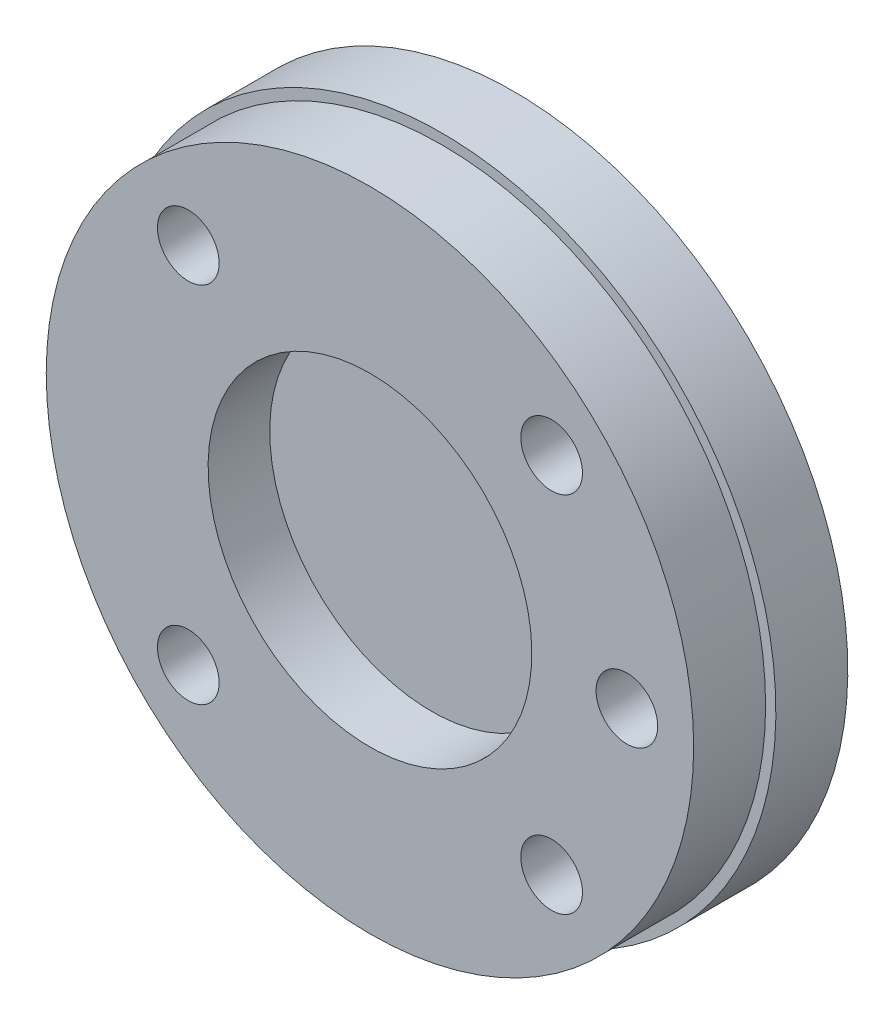
ISO-10303-21;
HEADER;
FILE_DESCRIPTION(('STEP AP214'),'2;1');
FILE_NAME('part.step','',(''),(''),'','','');
FILE_SCHEMA(('AUTOMOTIVE_DESIGN { 1 0 10303 214 1 1 1 1 }'));
ENDSEC;
DATA;
#1=APPLICATION_CONTEXT('core data for automotive mechanical design processes');
#2=APPLICATION_PROTOCOL_DEFINITION('international standard','automotive_design',2000,#1);
#3=PRODUCT_CONTEXT('',#1,'mechanical');
#4=PRODUCT('Part','Part','',(#3));
#5=PRODUCT_RELATED_PRODUCT_CATEGORY('part','',(#4));
#6=PRODUCT_DEFINITION_FORMATION('','',#4);
#7=PRODUCT_DEFINITION_CONTEXT('part definition',#1,'design');
#8=PRODUCT_DEFINITION('design','',#6,#7);
#9=PRODUCT_DEFINITION_SHAPE('','',#8);
#10=(LENGTH_UNIT() NAMED_UNIT(*) SI_UNIT(.MILLI.,.METRE.));
#11=(NAMED_UNIT(*) PLANE_ANGLE_UNIT() SI_UNIT($,.RADIAN.));
#12=(NAMED_UNIT(*) SI_UNIT($,.STERADIAN.) SOLID_ANGLE_UNIT());
#13=UNCERTAINTY_MEASURE_WITH_UNIT(LENGTH_MEASURE(1.E-05),#10,'distance_accuracy_value','');
#14=(GEOMETRIC_REPRESENTATION_CONTEXT(3) GLOBAL_UNCERTAINTY_ASSIGNED_CONTEXT((#13)) GLOBAL_UNIT_ASSIGNED_CONTEXT((#10,
#11,#12)) REPRESENTATION_CONTEXT('',''));
#15=CARTESIAN_POINT('',(0.,0.,0.));
#16=DIRECTION('',(0.,0.,1.));
#17=DIRECTION('',(1.,0.,0.));
#18=AXIS2_PLACEMENT_3D('',#15,#16,#17);
#19=CARTESIAN_POINT('',(1.3574208424E-10,0.,-6.00000000602));
#20=DIRECTION('',(0.,0.,-1.));
#21=DIRECTION('',(0.,1.,0.));
#22=AXIS2_PLACEMENT_3D('',#19,#20,#21);
#23=PLANE('',#22);
#24=CARTESIAN_POINT('',(-3.5120137909E-09,0.,-6.00000000602));
#25=DIRECTION('',(0.,0.,-1.));
#26=DIRECTION('',(0.,1.,0.));
#27=AXIS2_PLACEMENT_3D('',#24,#25,#26);
#28=CIRCLE('',#27,15.75);
#29=CARTESIAN_POINT('',(-3.5120137909E-09,15.75,-6.00000000602));
#30=VERTEX_POINT('',#29);
#31=EDGE_CURVE('E18',#30,#30,#28,.F.);
#32=ORIENTED_EDGE('',*,*,#31,.T.);
#33=EDGE_LOOP('',(#32));
#34=FACE_BOUND('',#33,.T.);
#35=ADVANCED_FACE('F15',(#34),#23,.F.);
#36=CARTESIAN_POINT('',(-3.5120137909E-09,0.,2.99678504234E-10));
#37=DIRECTION('',(0.,0.,-1.));
#38=DIRECTION('',(0.,1.,0.));
#39=AXIS2_PLACEMENT_3D('',#36,#37,#38);
#40=CYLINDRICAL_SURFACE('',#39,15.75);
#41=ORIENTED_EDGE('',*,*,#31,.F.);
#42=EDGE_LOOP('',(#41));
#43=FACE_BOUND('',#42,.T.);
#44=CARTESIAN_POINT('',(-3.5120137909E-09,0.,-2.27373675443005E-13));
#45=DIRECTION('',(0.,0.,-1.));
#46=DIRECTION('',(0.,1.,0.));
#47=AXIS2_PLACEMENT_3D('',#44,#45,#46);
#48=CIRCLE('',#47,15.75);
#49=CARTESIAN_POINT('',(-3.5120137909E-09,15.75,-2.27373675443005E-13));
#50=VERTEX_POINT('',#49);
#51=EDGE_CURVE('E94',#50,#50,#48,.F.);
#52=ORIENTED_EDGE('',*,*,#51,.T.);
#53=EDGE_LOOP('',(#52));
#54=FACE_BOUND('',#53,.T.);
#55=ADVANCED_FACE('F102',(#43,#54),#40,.F.);
#56=CARTESIAN_POINT('',(24.999999996,0.,-2.27373675443E-13));
#57=DIRECTION('',(0.,0.,-1.));
#58=DIRECTION('',(0.,1.,0.));
#59=AXIS2_PLACEMENT_3D('',#56,#57,#58);
#60=PLANE('',#59);
#61=ORIENTED_EDGE('',*,*,#51,.F.);
#62=EDGE_LOOP('',(#61));
#63=FACE_BOUND('',#62,.T.);
#64=CARTESIAN_POINT('',(24.999999996,0.,-2.27373675443E-13));
#65=DIRECTION('',(0.,0.,-1.));
#66=DIRECTION('',(0.,1.,0.));
#67=AXIS2_PLACEMENT_3D('',#64,#65,#66);
#68=CIRCLE('',#67,3.);
#69=CARTESIAN_POINT('',(24.999999996,3.00000000000001,-2.27373675443E-13));
#70=VERTEX_POINT('',#69);
#71=EDGE_CURVE('E77',#70,#70,#68,.T.);
#72=ORIENTED_EDGE('',*,*,#71,.T.);
#73=EDGE_LOOP('',(#72));
#74=FACE_BOUND('',#73,.T.);
#75=CARTESIAN_POINT('',(-17.6776695313,17.6776695297,-2.27581842260013E-13));
#76=DIRECTION('',(0.,0.,-1.));
#77=DIRECTION('',(0.,1.,0.));
#78=AXIS2_PLACEMENT_3D('',#75,#76,#77);
#79=CIRCLE('',#78,3.);
#80=CARTESIAN_POINT('',(-17.6776695313,20.6776695297,-2.27258010690408E-13));
#81=VERTEX_POINT('',#80);
#82=EDGE_CURVE('E80',#81,#81,#79,.T.);
#83=ORIENTED_EDGE('',*,*,#82,.T.);
#84=EDGE_LOOP('',(#83));
#85=FACE_BOUND('',#84,.T.);
#86=CARTESIAN_POINT('',(-17.6776695313,-17.6776695297,-2.27456942169465E-13));
#87=DIRECTION('',(0.,0.,-1.));
#88=DIRECTION('',(0.,1.,0.));
#89=AXIS2_PLACEMENT_3D('',#86,#87,#88);
#90=CIRCLE('',#89,3.);
#91=CARTESIAN_POINT('',(-17.6776695313,-14.6776695297,-2.27339185235064E-13));
#92=VERTEX_POINT('',#91);
#93=EDGE_CURVE('E83',#92,#92,#90,.T.);
#94=ORIENTED_EDGE('',*,*,#93,.T.);
#95=EDGE_LOOP('',(#94));
#96=FACE_BOUND('',#95,.T.);
#97=CARTESIAN_POINT('',(17.6776695284,17.6776695297,-2.27290408715939E-13));
#98=DIRECTION('',(0.,0.,-1.));
#99=DIRECTION('',(0.,1.,0.));
#100=AXIS2_PLACEMENT_3D('',#97,#98,#99);
#101=CIRCLE('',#100,3.);
#102=CARTESIAN_POINT('',(17.6776695284,20.6776695297,-2.27172651781538E-13));
#103=VERTEX_POINT('',#102);
#104=EDGE_CURVE('E86',#103,#103,#101,.T.);
#105=ORIENTED_EDGE('',*,*,#104,.T.);
#106=EDGE_LOOP('',(#105));
#107=FACE_BOUND('',#106,.T.);
#108=CARTESIAN_POINT('',(17.6776695284,-17.6776695297,-2.27165508625391E-13));
#109=DIRECTION('',(0.,0.,-1.));
#110=DIRECTION('',(0.,1.,0.));
#111=AXIS2_PLACEMENT_3D('',#108,#109,#110);
#112=CIRCLE('',#111,3.);
#113=CARTESIAN_POINT('',(17.6776695284,-14.6776695297,-2.26841677055786E-13));
#114=VERTEX_POINT('',#113);
#115=EDGE_CURVE('E89',#114,#114,#112,.T.);
#116=ORIENTED_EDGE('',*,*,#115,.T.);
#117=EDGE_LOOP('',(#116));
#118=FACE_BOUND('',#117,.T.);
#119=CARTESIAN_POINT('',(-1.75623426912E-09,0.,9.86574537342744E-10));
#120=DIRECTION('',(0.,0.,1.));
#121=DIRECTION('',(0.,-1.,0.));
#122=AXIS2_PLACEMENT_3D('',#119,#120,#121);
#123=CIRCLE('',#122,31.5);
#124=CARTESIAN_POINT('',(-1.75623426912E-09,-31.5,9.86574537342744E-10));
#125=VERTEX_POINT('',#124);
#126=EDGE_CURVE('E92',#125,#125,#123,.F.);
#127=ORIENTED_EDGE('',*,*,#126,.F.);
#128=EDGE_LOOP('',(#127));
#129=FACE_BOUND('',#128,.T.);
#130=ADVANCED_FACE('F104',(#63,#74,#85,#96,#107,#118,#129),#60,.F.);
#131=CARTESIAN_POINT('',(-1.75623426912E-09,0.,-7.00000000274));
#132=DIRECTION('',(0.,0.,1.));
#133=DIRECTION('',(0.,-1.,0.));
#134=AXIS2_PLACEMENT_3D('',#131,#132,#133);
#135=CYLINDRICAL_SURFACE('',#134,31.5);
#136=ORIENTED_EDGE('',*,*,#126,.T.);
#137=EDGE_LOOP('',(#136));
#138=FACE_BOUND('',#137,.T.);
#139=CARTESIAN_POINT('',(-1.75623426912E-09,0.,-7.00000000274));
#140=DIRECTION('',(0.,0.,1.));
#141=DIRECTION('',(0.,-1.,0.));
#142=AXIS2_PLACEMENT_3D('',#139,#140,#141);
#143=CIRCLE('',#142,31.5);
#144=CARTESIAN_POINT('',(-1.75623426912E-09,-31.5,-7.00000000274));
#145=VERTEX_POINT('',#144);
#146=EDGE_CURVE('E74',#145,#145,#143,.F.);
#147=ORIENTED_EDGE('',*,*,#146,.F.);
#148=EDGE_LOOP('',(#147));
#149=FACE_BOUND('',#148,.T.);
#150=ADVANCED_FACE('F110',(#138,#149),#135,.T.);
#151=CARTESIAN_POINT('',(17.6776695284,-17.6776695297,-4.36943992099E-09));
#152=DIRECTION('',(0.,0.,-1.));
#153=DIRECTION('',(0.,1.,0.));
#154=AXIS2_PLACEMENT_3D('',#151,#152,#153);
#155=CYLINDRICAL_SURFACE('',#154,3.);
#156=CARTESIAN_POINT('',(17.6776695284,-17.6776695297,-10.0000000062));
#157=DIRECTION('',(0.,0.,-1.));
#158=DIRECTION('',(0.,1.,0.));
#159=AXIS2_PLACEMENT_3D('',#156,#157,#158);
#160=CIRCLE('',#159,3.);
#161=CARTESIAN_POINT('',(17.6776695284,-14.6776695297,-10.0000000062));
#162=VERTEX_POINT('',#161);
#163=EDGE_CURVE('E71',#162,#162,#160,.T.);
#164=ORIENTED_EDGE('',*,*,#163,.T.);
#165=EDGE_LOOP('',(#164));
#166=FACE_BOUND('',#165,.T.);
#167=ORIENTED_EDGE('',*,*,#115,.F.);
#168=EDGE_LOOP('',(#167));
#169=FACE_BOUND('',#168,.T.);
#170=ADVANCED_FACE('F183',(#166,#169),#155,.F.);
#171=CARTESIAN_POINT('',(17.6776695284,17.6776695297,-4.36943992099E-09));
#172=DIRECTION('',(0.,0.,-1.));
#173=DIRECTION('',(0.,1.,0.));
#174=AXIS2_PLACEMENT_3D('',#171,#172,#173);
#175=CYLINDRICAL_SURFACE('',#174,3.);
#176=CARTESIAN_POINT('',(17.6776695284,17.6776695297,-10.0000000062));
#177=DIRECTION('',(0.,0.,-1.));
#178=DIRECTION('',(0.,1.,0.));
#179=AXIS2_PLACEMENT_3D('',#176,#177,#178);
#180=CIRCLE('',#179,3.);
#181=CARTESIAN_POINT('',(17.6776695284,20.6776695297,-10.0000000062));
#182=VERTEX_POINT('',#181);
#183=EDGE_CURVE('E68',#182,#182,#180,.T.);
#184=ORIENTED_EDGE('',*,*,#183,.T.);
#185=EDGE_LOOP('',(#184));
#186=FACE_BOUND('',#185,.T.);
#187=ORIENTED_EDGE('',*,*,#104,.F.);
#188=EDGE_LOOP('',(#187));
#189=FACE_BOUND('',#188,.T.);
#190=ADVANCED_FACE('F179',(#186,#189),#175,.F.);
#191=CARTESIAN_POINT('',(-17.6776695313,-17.6776695297,-4.19095158577E-09));
#192=DIRECTION('',(0.,0.,-1.));
#193=DIRECTION('',(0.,1.,0.));
#194=AXIS2_PLACEMENT_3D('',#191,#192,#193);
#195=CYLINDRICAL_SURFACE('',#194,3.);
#196=CARTESIAN_POINT('',(-17.6776695313,-17.6776695297,-10.0000000061));
#197=DIRECTION('',(0.,0.,-1.));
#198=DIRECTION('',(0.,1.,0.));
#199=AXIS2_PLACEMENT_3D('',#196,#197,#198);
#200=CIRCLE('',#199,3.);
#201=CARTESIAN_POINT('',(-17.6776695313,-14.6776695297,-10.0000000061));
#202=VERTEX_POINT('',#201);
#203=EDGE_CURVE('E65',#202,#202,#200,.T.);
#204=ORIENTED_EDGE('',*,*,#203,.T.);
#205=EDGE_LOOP('',(#204));
#206=FACE_BOUND('',#205,.T.);
#207=ORIENTED_EDGE('',*,*,#93,.F.);
#208=EDGE_LOOP('',(#207));
#209=FACE_BOUND('',#208,.T.);
#210=ADVANCED_FACE('F175',(#206,#209),#195,.F.);
#211=CARTESIAN_POINT('',(-17.6776695313,17.6776695297,-4.19095158577E-09));
#212=DIRECTION('',(0.,0.,-1.));
#213=DIRECTION('',(0.,1.,0.));
#214=AXIS2_PLACEMENT_3D('',#211,#212,#213);
#215=CYLINDRICAL_SURFACE('',#214,3.);
#216=CARTESIAN_POINT('',(-17.6776695313,17.6776695297,-10.0000000061));
#217=DIRECTION('',(0.,0.,-1.));
#218=DIRECTION('',(0.,1.,0.));
#219=AXIS2_PLACEMENT_3D('',#216,#217,#218);
#220=CIRCLE('',#219,3.);
#221=CARTESIAN_POINT('',(-17.6776695313,20.6776695297,-10.0000000061));
#222=VERTEX_POINT('',#221);
#223=EDGE_CURVE('E62',#222,#222,#220,.T.);
#224=ORIENTED_EDGE('',*,*,#223,.T.);
#225=EDGE_LOOP('',(#224));
#226=FACE_BOUND('',#225,.T.);
#227=ORIENTED_EDGE('',*,*,#82,.F.);
#228=EDGE_LOOP('',(#227));
#229=FACE_BOUND('',#228,.T.);
#230=ADVANCED_FACE('F171',(#226,#229),#215,.F.);
#231=CARTESIAN_POINT('',(24.999999996,0.,-2.27373675443E-13));
#232=DIRECTION('',(0.,0.,-1.));
#233=DIRECTION('',(0.,1.,0.));
#234=AXIS2_PLACEMENT_3D('',#231,#232,#233);
#235=CYLINDRICAL_SURFACE('',#234,3.);
#236=CARTESIAN_POINT('',(24.999999996,0.,-10.0000000019));
#237=DIRECTION('',(0.,0.,-1.));
#238=DIRECTION('',(0.,1.,0.));
#239=AXIS2_PLACEMENT_3D('',#236,#237,#238);
#240=CIRCLE('',#239,3.);
#241=CARTESIAN_POINT('',(24.999999996,3.00000000000001,-10.0000000019));
#242=VERTEX_POINT('',#241);
#243=EDGE_CURVE('E59',#242,#242,#240,.T.);
#244=ORIENTED_EDGE('',*,*,#243,.T.);
#245=EDGE_LOOP('',(#244));
#246=FACE_BOUND('',#245,.T.);
#247=ORIENTED_EDGE('',*,*,#71,.F.);
#248=EDGE_LOOP('',(#247));
#249=FACE_BOUND('',#248,.T.);
#250=ADVANCED_FACE('F167',(#246,#249),#235,.F.);
#251=CARTESIAN_POINT('',(-1.75623426912E-09,0.,-7.00000000274));
#252=DIRECTION('',(0.,0.,1.));
#253=DIRECTION('',(0.,-1.,0.));
#254=AXIS2_PLACEMENT_3D('',#251,#252,#253);
#255=PLANE('',#254);
#256=ORIENTED_EDGE('',*,*,#146,.T.);
#257=EDGE_LOOP('',(#256));
#258=FACE_BOUND('',#257,.T.);
#259=CARTESIAN_POINT('',(0.,0.,-7.00000000274));
#260=DIRECTION('',(0.,0.,1.));
#261=DIRECTION('',(0.,-1.,0.));
#262=AXIS2_PLACEMENT_3D('',#259,#260,#261);
#263=CIRCLE('',#262,32.5);
#264=CARTESIAN_POINT('',(0.,-32.5,-7.00000000274));
#265=VERTEX_POINT('',#264);
#266=EDGE_CURVE('E56',#265,#265,#263,.F.);
#267=ORIENTED_EDGE('',*,*,#266,.F.);
#268=EDGE_LOOP('',(#267));
#269=FACE_BOUND('',#268,.T.);
#270=ADVANCED_FACE('F163',(#258,#269),#255,.T.);
#271=CARTESIAN_POINT('',(17.6776695295,-17.6776695297,-10.0000000062));
#272=DIRECTION('',(0.,0.,-1.));
#273=DIRECTION('',(0.,1.,0.));
#274=AXIS2_PLACEMENT_3D('',#271,#272,#273);
#275=PLANE('',#274);
#276=CARTESIAN_POINT('',(17.6776695295,-17.6776695297,-10.0000000062));
#277=DIRECTION('',(0.,0.,-1.));
#278=DIRECTION('',(0.,1.,0.));
#279=AXIS2_PLACEMENT_3D('',#276,#277,#278);
#280=CIRCLE('',#279,2.75);
#281=CARTESIAN_POINT('',(17.6776695295,-14.9276695297,-10.0000000062));
#282=VERTEX_POINT('',#281);
#283=EDGE_CURVE('E53',#282,#282,#280,.T.);
#284=ORIENTED_EDGE('',*,*,#283,.T.);
#285=EDGE_LOOP('',(#284));
#286=FACE_BOUND('',#285,.T.);
#287=ORIENTED_EDGE('',*,*,#163,.F.);
#288=EDGE_LOOP('',(#287));
#289=FACE_BOUND('',#288,.T.);
#290=ADVANCED_FACE('F159',(#286,#289),#275,.F.);
#291=CARTESIAN_POINT('',(17.6776695295,17.6776695297,-10.0000000062));
#292=DIRECTION('',(0.,0.,-1.));
#293=DIRECTION('',(0.,1.,0.));
#294=AXIS2_PLACEMENT_3D('',#291,#292,#293);
#295=PLANE('',#294);
#296=CARTESIAN_POINT('',(17.6776695295,17.6776695297,-10.0000000062));
#297=DIRECTION('',(0.,0.,-1.));
#298=DIRECTION('',(0.,1.,0.));
#299=AXIS2_PLACEMENT_3D('',#296,#297,#298);
#300=CIRCLE('',#299,2.75);
#301=CARTESIAN_POINT('',(17.6776695295,20.4276695297,-10.0000000062));
#302=VERTEX_POINT('',#301);
#303=EDGE_CURVE('E50',#302,#302,#300,.T.);
#304=ORIENTED_EDGE('',*,*,#303,.T.);
#305=EDGE_LOOP('',(#304));
#306=FACE_BOUND('',#305,.T.);
#307=ORIENTED_EDGE('',*,*,#183,.F.);
#308=EDGE_LOOP('',(#307));
#309=FACE_BOUND('',#308,.T.);
#310=ADVANCED_FACE('F155',(#306,#309),#295,.F.);
#311=CARTESIAN_POINT('',(-17.6776695302,-17.6776695297,-10.0000000061));
#312=DIRECTION('',(0.,0.,-1.));
#313=DIRECTION('',(0.,1.,0.));
#314=AXIS2_PLACEMENT_3D('',#311,#312,#313);
#315=PLANE('',#314);
#316=CARTESIAN_POINT('',(-17.6776695302,-17.6776695297,-10.0000000061));
#317=DIRECTION('',(0.,0.,-1.));
#318=DIRECTION('',(0.,1.,0.));
#319=AXIS2_PLACEMENT_3D('',#316,#317,#318);
#320=CIRCLE('',#319,2.75);
#321=CARTESIAN_POINT('',(-17.6776695302,-14.9276695297,-10.0000000061));
#322=VERTEX_POINT('',#321);
#323=EDGE_CURVE('E47',#322,#322,#320,.T.);
#324=ORIENTED_EDGE('',*,*,#323,.T.);
#325=EDGE_LOOP('',(#324));
#326=FACE_BOUND('',#325,.T.);
#327=ORIENTED_EDGE('',*,*,#203,.F.);
#328=EDGE_LOOP('',(#327));
#329=FACE_BOUND('',#328,.T.);
#330=ADVANCED_FACE('F151',(#326,#329),#315,.F.);
#331=CARTESIAN_POINT('',(-17.6776695302,17.6776695297,-10.0000000061));
#332=DIRECTION('',(0.,0.,-1.));
#333=DIRECTION('',(0.,1.,0.));
#334=AXIS2_PLACEMENT_3D('',#331,#332,#333);
#335=PLANE('',#334);
#336=CARTESIAN_POINT('',(-17.6776695302,17.6776695297,-10.0000000061));
#337=DIRECTION('',(0.,0.,-1.));
#338=DIRECTION('',(0.,1.,0.));
#339=AXIS2_PLACEMENT_3D('',#336,#337,#338);
#340=CIRCLE('',#339,2.75);
#341=CARTESIAN_POINT('',(-17.6776695302,20.4276695297,-10.0000000061));
#342=VERTEX_POINT('',#341);
#343=EDGE_CURVE('E44',#342,#342,#340,.T.);
#344=ORIENTED_EDGE('',*,*,#343,.T.);
#345=EDGE_LOOP('',(#344));
#346=FACE_BOUND('',#345,.T.);
#347=ORIENTED_EDGE('',*,*,#223,.F.);
#348=EDGE_LOOP('',(#347));
#349=FACE_BOUND('',#348,.T.);
#350=ADVANCED_FACE('F147',(#346,#349),#335,.F.);
#351=CARTESIAN_POINT('',(24.999999997,0.,-10.0000000019));
#352=DIRECTION('',(0.,0.,-1.));
#353=DIRECTION('',(0.,1.,0.));
#354=AXIS2_PLACEMENT_3D('',#351,#352,#353);
#355=PLANE('',#354);
#356=CARTESIAN_POINT('',(24.999999997,0.,-10.0000000019));
#357=DIRECTION('',(0.,0.,-1.));
#358=DIRECTION('',(0.,1.,0.));
#359=AXIS2_PLACEMENT_3D('',#356,#357,#358);
#360=CIRCLE('',#359,2.75);
#361=CARTESIAN_POINT('',(24.999999997,2.75000000000001,-10.0000000019));
#362=VERTEX_POINT('',#361);
#363=EDGE_CURVE('E41',#362,#362,#360,.T.);
#364=ORIENTED_EDGE('',*,*,#363,.T.);
#365=EDGE_LOOP('',(#364));
#366=FACE_BOUND('',#365,.T.);
#367=ORIENTED_EDGE('',*,*,#243,.F.);
#368=EDGE_LOOP('',(#367));
#369=FACE_BOUND('',#368,.T.);
#370=ADVANCED_FACE('F143',(#366,#369),#355,.F.);
#371=CARTESIAN_POINT('',(0.,0.,-14.0000000058));
#372=DIRECTION('',(0.,0.,1.));
#373=DIRECTION('',(0.,-1.,0.));
#374=AXIS2_PLACEMENT_3D('',#371,#372,#373);
#375=CYLINDRICAL_SURFACE('',#374,32.5);
#376=ORIENTED_EDGE('',*,*,#266,.T.);
#377=EDGE_LOOP('',(#376));
#378=FACE_BOUND('',#377,.T.);
#379=CARTESIAN_POINT('',(0.,0.,-14.0000000058));
#380=DIRECTION('',(0.,0.,1.));
#381=DIRECTION('',(0.,-1.,0.));
#382=AXIS2_PLACEMENT_3D('',#379,#380,#381);
#383=CIRCLE('',#382,32.5);
#384=CARTESIAN_POINT('',(0.,-32.5,-14.0000000058));
#385=VERTEX_POINT('',#384);
#386=EDGE_CURVE('E38',#385,#385,#383,.F.);
#387=ORIENTED_EDGE('',*,*,#386,.F.);
#388=EDGE_LOOP('',(#387));
#389=FACE_BOUND('',#388,.T.);
#390=ADVANCED_FACE('F139',(#378,#389),#375,.T.);
#391=CARTESIAN_POINT('',(17.6776695295,-17.6776695297,-10.0000000062));
#392=DIRECTION('',(0.,0.,-1.));
#393=DIRECTION('',(0.,1.,0.));
#394=AXIS2_PLACEMENT_3D('',#391,#392,#393);
#395=CYLINDRICAL_SURFACE('',#394,2.75);
#396=CARTESIAN_POINT('',(17.6776695295,-17.6776695297,-14.000000008));
#397=DIRECTION('',(0.,0.,-1.));
#398=DIRECTION('',(0.,1.,0.));
#399=AXIS2_PLACEMENT_3D('',#396,#397,#398);
#400=CIRCLE('',#399,2.75);
#401=CARTESIAN_POINT('',(17.6776695295,-14.9276695297,-14.000000008));
#402=VERTEX_POINT('',#401);
#403=EDGE_CURVE('E35',#402,#402,#400,.F.);
#404=ORIENTED_EDGE('',*,*,#403,.F.);
#405=EDGE_LOOP('',(#404));
#406=FACE_BOUND('',#405,.T.);
#407=ORIENTED_EDGE('',*,*,#283,.F.);
#408=EDGE_LOOP('',(#407));
#409=FACE_BOUND('',#408,.T.);
#410=ADVANCED_FACE('F135',(#406,#409),#395,.F.);
#411=CARTESIAN_POINT('',(17.6776695295,17.6776695297,-10.0000000062));
#412=DIRECTION('',(0.,0.,-1.));
#413=DIRECTION('',(0.,1.,0.));
#414=AXIS2_PLACEMENT_3D('',#411,#412,#413);
#415=CYLINDRICAL_SURFACE('',#414,2.75);
#416=CARTESIAN_POINT('',(17.6776695295,17.6776695297,-14.000000008));
#417=DIRECTION('',(0.,0.,-1.));
#418=DIRECTION('',(0.,1.,0.));
#419=AXIS2_PLACEMENT_3D('',#416,#417,#418);
#420=CIRCLE('',#419,2.75);
#421=CARTESIAN_POINT('',(17.6776695295,20.4276695297,-14.000000008));
#422=VERTEX_POINT('',#421);
#423=EDGE_CURVE('E32',#422,#422,#420,.F.);
#424=ORIENTED_EDGE('',*,*,#423,.F.);
#425=EDGE_LOOP('',(#424));
#426=FACE_BOUND('',#425,.T.);
#427=ORIENTED_EDGE('',*,*,#303,.F.);
#428=EDGE_LOOP('',(#427));
#429=FACE_BOUND('',#428,.T.);
#430=ADVANCED_FACE('F131',(#426,#429),#415,.F.);
#431=CARTESIAN_POINT('',(-17.6776695302,-17.6776695297,-10.0000000061));
#432=DIRECTION('',(0.,0.,-1.));
#433=DIRECTION('',(0.,1.,0.));
#434=AXIS2_PLACEMENT_3D('',#431,#432,#433);
#435=CYLINDRICAL_SURFACE('',#434,2.75);
#436=CARTESIAN_POINT('',(-17.6776695302,-17.6776695297,-14.000000008));
#437=DIRECTION('',(0.,0.,-1.));
#438=DIRECTION('',(0.,1.,0.));
#439=AXIS2_PLACEMENT_3D('',#436,#437,#438);
#440=CIRCLE('',#439,2.75);
#441=CARTESIAN_POINT('',(-17.6776695302,-14.9276695297,-14.000000008));
#442=VERTEX_POINT('',#441);
#443=EDGE_CURVE('E27',#442,#442,#440,.F.);
#444=ORIENTED_EDGE('',*,*,#443,.F.);
#445=EDGE_LOOP('',(#444));
#446=FACE_BOUND('',#445,.T.);
#447=ORIENTED_EDGE('',*,*,#323,.F.);
#448=EDGE_LOOP('',(#447));
#449=FACE_BOUND('',#448,.T.);
#450=ADVANCED_FACE('F127',(#446,#449),#435,.F.);
#451=CARTESIAN_POINT('',(-17.6776695302,17.6776695297,-10.0000000061));
#452=DIRECTION('',(0.,0.,-1.));
#453=DIRECTION('',(0.,1.,0.));
#454=AXIS2_PLACEMENT_3D('',#451,#452,#453);
#455=CYLINDRICAL_SURFACE('',#454,2.75);
#456=CARTESIAN_POINT('',(-17.6776695302,17.6776695297,-14.000000008));
#457=DIRECTION('',(0.,0.,-1.));
#458=DIRECTION('',(0.,1.,0.));
#459=AXIS2_PLACEMENT_3D('',#456,#457,#458);
#460=CIRCLE('',#459,2.75);
#461=CARTESIAN_POINT('',(-17.6776695302,20.4276695297,-14.000000008));
#462=VERTEX_POINT('',#461);
#463=EDGE_CURVE('E22',#462,#462,#460,.F.);
#464=ORIENTED_EDGE('',*,*,#463,.F.);
#465=EDGE_LOOP('',(#464));
#466=FACE_BOUND('',#465,.T.);
#467=ORIENTED_EDGE('',*,*,#343,.F.);
#468=EDGE_LOOP('',(#467));
#469=FACE_BOUND('',#468,.T.);
#470=ADVANCED_FACE('F120',(#466,#469),#455,.F.);
#471=CARTESIAN_POINT('',(24.999999997,0.,-10.0000000019));
#472=DIRECTION('',(0.,0.,-1.));
#473=DIRECTION('',(0.,1.,0.));
#474=AXIS2_PLACEMENT_3D('',#471,#472,#473);
#475=CYLINDRICAL_SURFACE('',#474,2.75);
#476=CARTESIAN_POINT('',(24.999999997,0.,-14.000000008));
#477=DIRECTION('',(0.,0.,-1.));
#478=DIRECTION('',(0.,1.,0.));
#479=AXIS2_PLACEMENT_3D('',#476,#477,#478);
#480=CIRCLE('',#479,2.75);
#481=CARTESIAN_POINT('',(24.999999997,2.75000000000001,-14.000000008));
#482=VERTEX_POINT('',#481);
#483=EDGE_CURVE('E10',#482,#482,#480,.F.);
#484=ORIENTED_EDGE('',*,*,#483,.F.);
#485=EDGE_LOOP('',(#484));
#486=FACE_BOUND('',#485,.T.);
#487=ORIENTED_EDGE('',*,*,#363,.F.);
#488=EDGE_LOOP('',(#487));
#489=FACE_BOUND('',#488,.T.);
#490=ADVANCED_FACE('F115',(#486,#489),#475,.F.);
#491=CARTESIAN_POINT('',(-215.000000004,0.,-14.000000008));
#492=DIRECTION('',(0.,0.,-1.));
#493=DIRECTION('',(0.,1.,0.));
#494=AXIS2_PLACEMENT_3D('',#491,#492,#493);
#495=PLANE('',#494);
#496=ORIENTED_EDGE('',*,*,#483,.T.);
#497=EDGE_LOOP('',(#496));
#498=FACE_BOUND('',#497,.T.);
#499=ORIENTED_EDGE('',*,*,#463,.T.);
#500=EDGE_LOOP('',(#499));
#501=FACE_BOUND('',#500,.T.);
#502=ORIENTED_EDGE('',*,*,#443,.T.);
#503=EDGE_LOOP('',(#502));
#504=FACE_BOUND('',#503,.T.);
#505=ORIENTED_EDGE('',*,*,#423,.T.);
#506=EDGE_LOOP('',(#505));
#507=FACE_BOUND('',#506,.T.);
#508=ORIENTED_EDGE('',*,*,#403,.T.);
#509=EDGE_LOOP('',(#508));
#510=FACE_BOUND('',#509,.T.);
#511=ORIENTED_EDGE('',*,*,#386,.T.);
#512=EDGE_LOOP('',(#511));
#513=FACE_BOUND('',#512,.T.);
#514=ADVANCED_FACE('F113',(#498,#501,#504,#507,#510,#513),#495,.T.);
#515=CLOSED_SHELL('',(#35,#55,#130,#150,#170,#190,#210,#230,#250,#270,#290,#310,#330,#350,#370,
#390,#410,#430,#450,#470,#490,#514));
#516=MANIFOLD_SOLID_BREP('B1',#515);
#517=ADVANCED_BREP_SHAPE_REPRESENTATION('',(#18,#516),#14);
#518=SHAPE_DEFINITION_REPRESENTATION(#9,#517);
ENDSEC;
END-ISO-10303-21;
